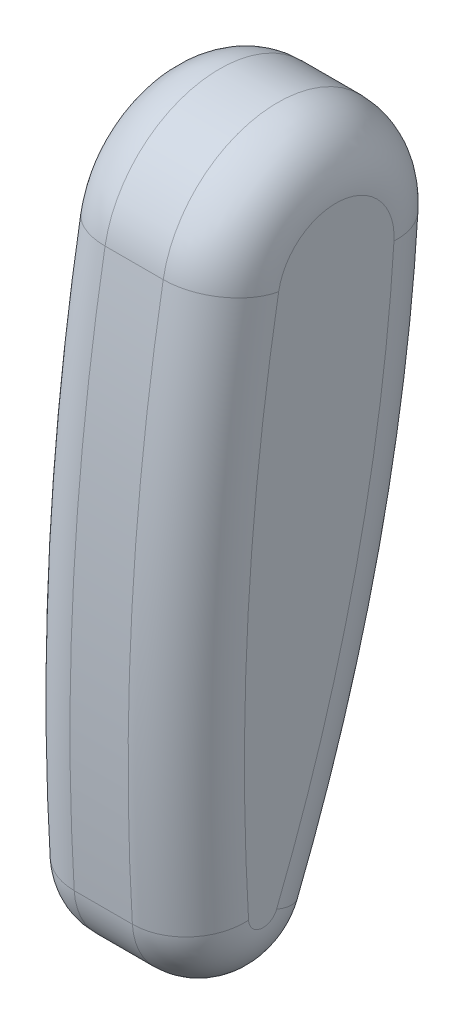
ISO-10303-21;
HEADER;
FILE_DESCRIPTION(('STEP AP214'),'2;1');
FILE_NAME('part.step','',(''),(''),'','','');
FILE_SCHEMA(('AUTOMOTIVE_DESIGN { 1 0 10303 214 1 1 1 1 }'));
ENDSEC;
DATA;
#1=APPLICATION_CONTEXT('core data for automotive mechanical design processes');
#2=APPLICATION_PROTOCOL_DEFINITION('international standard','automotive_design',2000,#1);
#3=PRODUCT_CONTEXT('',#1,'mechanical');
#4=PRODUCT('Part','Part','',(#3));
#5=PRODUCT_RELATED_PRODUCT_CATEGORY('part','',(#4));
#6=PRODUCT_DEFINITION_FORMATION('','',#4);
#7=PRODUCT_DEFINITION_CONTEXT('part definition',#1,'design');
#8=PRODUCT_DEFINITION('design','',#6,#7);
#9=PRODUCT_DEFINITION_SHAPE('','',#8);
#10=(LENGTH_UNIT() NAMED_UNIT(*) SI_UNIT(.MILLI.,.METRE.));
#11=(NAMED_UNIT(*) PLANE_ANGLE_UNIT() SI_UNIT($,.RADIAN.));
#12=(NAMED_UNIT(*) SI_UNIT($,.STERADIAN.) SOLID_ANGLE_UNIT());
#13=UNCERTAINTY_MEASURE_WITH_UNIT(LENGTH_MEASURE(1.E-05),#10,'distance_accuracy_value','');
#14=(GEOMETRIC_REPRESENTATION_CONTEXT(3) GLOBAL_UNCERTAINTY_ASSIGNED_CONTEXT((#13)) GLOBAL_UNIT_ASSIGNED_CONTEXT((#10,
#11,#12)) REPRESENTATION_CONTEXT('',''));
#15=CARTESIAN_POINT('',(0.,0.,0.));
#16=DIRECTION('',(0.,0.,1.));
#17=DIRECTION('',(1.,0.,0.));
#18=AXIS2_PLACEMENT_3D('',#15,#16,#17);
#19=CARTESIAN_POINT('',(190.5,-636.965855606091,-1940.75192617247));
#20=DIRECTION('',(-1.,0.,0.));
#21=DIRECTION('',(0.,0.,1.));
#22=AXIS2_PLACEMENT_3D('',#19,#20,#21);
#23=CYLINDRICAL_SURFACE('',#22,2032.);
#24=DIRECTION('',(-1.,0.,0.));
#25=VECTOR('',#24,1.);
#26=CARTESIAN_POINT('',(190.5,-285.382596894668,60.6009193282554));
#27=LINE('',#26,#25);
#28=CARTESIAN_POINT('',(139.7,-285.382596894668,60.6009193282554));
#29=VERTEX_POINT('',#28);
#30=CARTESIAN_POINT('',(88.9000000000001,-285.382596894668,60.6009193282554));
#31=VERTEX_POINT('',#30);
#32=EDGE_CURVE('E144',#29,#31,#27,.T.);
#33=ORIENTED_EDGE('',*,*,#32,.T.);
#34=CARTESIAN_POINT('',(88.9000000000001,-636.965855606091,-1940.75192617247));
#35=DIRECTION('',(-1.,0.,0.));
#36=DIRECTION('',(0.,0.,1.));
#37=AXIS2_PLACEMENT_3D('',#34,#35,#36);
#38=CIRCLE('',#37,2032.);
#39=CARTESIAN_POINT('',(88.9000000000001,-759.542851996072,87.547578327791));
#40=VERTEX_POINT('',#39);
#41=EDGE_CURVE('E153',#31,#40,#38,.F.);
#42=ORIENTED_EDGE('',*,*,#41,.T.);
#43=DIRECTION('',(-1.,0.,0.));
#44=VECTOR('',#43,1.);
#45=CARTESIAN_POINT('',(190.5,-759.542851996072,87.547578327791));
#46=LINE('',#45,#44);
#47=CARTESIAN_POINT('',(139.7,-759.542851996072,87.547578327791));
#48=VERTEX_POINT('',#47);
#49=EDGE_CURVE('E122',#48,#40,#46,.T.);
#50=ORIENTED_EDGE('',*,*,#49,.F.);
#51=CARTESIAN_POINT('',(139.7,-636.965855606091,-1940.75192617247));
#52=DIRECTION('',(-1.,0.,0.));
#53=DIRECTION('',(0.,0.,1.));
#54=AXIS2_PLACEMENT_3D('',#51,#52,#53);
#55=CIRCLE('',#54,2032.);
#56=EDGE_CURVE('E155',#48,#29,#55,.T.);
#57=ORIENTED_EDGE('',*,*,#56,.T.);
#58=EDGE_LOOP('',(#33,#42,#50,#57));
#59=FACE_BOUND('',#58,.T.);
#60=ADVANCED_FACE('F35',(#59),#23,.T.);
#61=CARTESIAN_POINT('',(190.5,-755.712320858886,24.1632188121575));
#62=DIRECTION('',(-1.,0.,0.));
#63=DIRECTION('',(0.,0.,1.));
#64=AXIS2_PLACEMENT_3D('',#61,#62,#63);
#65=CYLINDRICAL_SURFACE('',#64,63.5000000000002);
#66=ORIENTED_EDGE('',*,*,#49,.T.);
#67=CARTESIAN_POINT('',(88.9000000000001,-755.712320858886,24.1632188121575));
#68=DIRECTION('',(-1.,0.,0.));
#69=DIRECTION('',(0.,0.,1.));
#70=AXIS2_PLACEMENT_3D('',#67,#68,#69);
#71=CIRCLE('',#70,63.5000000000002);
#72=CARTESIAN_POINT('',(88.9000000000001,-779.308424571083,-34.7899311427282));
#73=VERTEX_POINT('',#72);
#74=EDGE_CURVE('E121',#40,#73,#71,.F.);
#75=ORIENTED_EDGE('',*,*,#74,.T.);
#76=DIRECTION('',(-1.,0.,0.));
#77=VECTOR('',#76,1.);
#78=CARTESIAN_POINT('',(190.5,-779.308424571083,-34.7899311427282));
#79=LINE('',#78,#77);
#80=CARTESIAN_POINT('',(139.7,-779.308424571083,-34.7899311427282));
#81=VERTEX_POINT('',#80);
#82=EDGE_CURVE('E104',#81,#73,#79,.T.);
#83=ORIENTED_EDGE('',*,*,#82,.F.);
#84=CARTESIAN_POINT('',(139.7,-755.712320858886,24.1632188121575));
#85=DIRECTION('',(-1.,0.,0.));
#86=DIRECTION('',(0.,0.,1.));
#87=AXIS2_PLACEMENT_3D('',#84,#85,#86);
#88=CIRCLE('',#87,63.5000000000002);
#89=EDGE_CURVE('E118',#81,#48,#88,.T.);
#90=ORIENTED_EDGE('',*,*,#89,.T.);
#91=EDGE_LOOP('',(#66,#75,#83,#90));
#92=FACE_BOUND('',#91,.T.);
#93=ADVANCED_FACE('F117',(#92),#65,.T.);
#94=CARTESIAN_POINT('',(190.5,-213.001935478344,1380.08566777453));
#95=DIRECTION('',(-1.,0.,0.));
#96=DIRECTION('',(0.,0.,1.));
#97=AXIS2_PLACEMENT_3D('',#94,#95,#96);
#98=CYLINDRICAL_SURFACE('',#97,1524.);
#99=ORIENTED_EDGE('',*,*,#82,.T.);
#100=CARTESIAN_POINT('',(88.9000000000001,-213.001935478344,1380.08566777453));
#101=DIRECTION('',(-1.,0.,0.));
#102=DIRECTION('',(0.,0.,1.));
#103=AXIS2_PLACEMENT_3D('',#100,#101,#102);
#104=CIRCLE('',#103,1524.);
#105=CARTESIAN_POINT('',(88.9000000000001,-309.38746156966,-140.863322284017));
#106=VERTEX_POINT('',#105);
#107=EDGE_CURVE('E110',#73,#106,#104,.F.);
#108=ORIENTED_EDGE('',*,*,#107,.T.);
#109=DIRECTION('',(-1.,0.,0.));
#110=VECTOR('',#109,1.);
#111=CARTESIAN_POINT('',(190.5,-309.38746156966,-140.863322284017));
#112=LINE('',#111,#110);
#113=CARTESIAN_POINT('',(139.7,-309.38746156966,-140.863322284017));
#114=VERTEX_POINT('',#113);
#115=EDGE_CURVE('E106',#114,#106,#112,.T.);
#116=ORIENTED_EDGE('',*,*,#115,.F.);
#117=CARTESIAN_POINT('',(139.7,-213.001935478344,1380.08566777453));
#118=DIRECTION('',(-1.,0.,0.));
#119=DIRECTION('',(0.,0.,1.));
#120=AXIS2_PLACEMENT_3D('',#117,#118,#119);
#121=CIRCLE('',#120,1524.);
#122=EDGE_CURVE('E101',#114,#81,#121,.T.);
#123=ORIENTED_EDGE('',*,*,#122,.T.);
#124=EDGE_LOOP('',(#99,#108,#116,#123));
#125=FACE_BOUND('',#124,.T.);
#126=ADVANCED_FACE('F103',(#125),#98,.T.);
#127=CARTESIAN_POINT('',(190.5,-302.961759830239,-39.4667229467812));
#128=DIRECTION('',(-1.,0.,0.));
#129=DIRECTION('',(0.,0.,1.));
#130=AXIS2_PLACEMENT_3D('',#127,#128,#129);
#131=CYLINDRICAL_SURFACE('',#130,101.6);
#132=ORIENTED_EDGE('',*,*,#115,.T.);
#133=CARTESIAN_POINT('',(88.9000000000001,-302.961759830239,-39.4667229467812));
#134=DIRECTION('',(-1.,0.,0.));
#135=DIRECTION('',(0.,0.,1.));
#136=AXIS2_PLACEMENT_3D('',#133,#134,#135);
#137=CIRCLE('',#136,101.6);
#138=EDGE_CURVE('E157',#106,#31,#137,.F.);
#139=ORIENTED_EDGE('',*,*,#138,.T.);
#140=ORIENTED_EDGE('',*,*,#32,.F.);
#141=CARTESIAN_POINT('',(139.7,-302.961759830239,-39.4667229467812));
#142=DIRECTION('',(-1.,0.,0.));
#143=DIRECTION('',(0.,0.,1.));
#144=AXIS2_PLACEMENT_3D('',#141,#142,#143);
#145=CIRCLE('',#144,101.6);
#146=EDGE_CURVE('E159',#29,#114,#145,.T.);
#147=ORIENTED_EDGE('',*,*,#146,.T.);
#148=EDGE_LOOP('',(#132,#139,#140,#147));
#149=FACE_BOUND('',#148,.T.);
#150=ADVANCED_FACE('F197',(#149),#131,.T.);
#151=CARTESIAN_POINT('',(190.5,-469.963807718165,-990.109324559626));
#152=DIRECTION('',(-1.,0.,0.));
#153=DIRECTION('',(0.,0.,1.));
#154=AXIS2_PLACEMENT_3D('',#151,#152,#153);
#155=PLANE('',#154);
#156=CARTESIAN_POINT('',(190.5,-213.001935478344,1380.08566777453));
#157=DIRECTION('',(-1.,0.,0.));
#158=DIRECTION('',(0.,0.,1.));
#159=AXIS2_PLACEMENT_3D('',#156,#157,#158);
#160=CIRCLE('',#159,1473.2);
#161=CARTESIAN_POINT('',(190.5,-760.431541601325,12.3725888211802));
#162=VERTEX_POINT('',#161);
#163=CARTESIAN_POINT('',(190.5,-306.174610699949,-90.1650226153994));
#164=VERTEX_POINT('',#163);
#165=EDGE_CURVE('E44',#162,#164,#160,.F.);
#166=ORIENTED_EDGE('',*,*,#165,.T.);
#167=CARTESIAN_POINT('',(190.5,-302.961759830239,-39.4667229467812));
#168=DIRECTION('',(-1.,0.,0.));
#169=DIRECTION('',(0.,0.,1.));
#170=AXIS2_PLACEMENT_3D('',#167,#168,#169);
#171=CIRCLE('',#170,50.8000000000002);
#172=CARTESIAN_POINT('',(190.5,-294.172178362453,10.5670981907374));
#173=VERTEX_POINT('',#172);
#174=EDGE_CURVE('E11',#164,#173,#171,.F.);
#175=ORIENTED_EDGE('',*,*,#174,.T.);
#176=CARTESIAN_POINT('',(190.5,-636.965855606091,-1940.75192617247));
#177=DIRECTION('',(-1.,0.,0.));
#178=DIRECTION('',(0.,0.,1.));
#179=AXIS2_PLACEMENT_3D('',#176,#177,#178);
#180=CIRCLE('',#179,1981.2);
#181=CARTESIAN_POINT('',(190.5,-756.478427086323,36.8400907152844));
#182=VERTEX_POINT('',#181);
#183=EDGE_CURVE('E151',#173,#182,#180,.F.);
#184=ORIENTED_EDGE('',*,*,#183,.T.);
#185=CARTESIAN_POINT('',(190.5,-755.712320858886,24.1632188121575));
#186=DIRECTION('',(-1.,0.,0.));
#187=DIRECTION('',(0.,0.,1.));
#188=AXIS2_PLACEMENT_3D('',#185,#186,#187);
#189=CIRCLE('',#188,12.7000000000002);
#190=EDGE_CURVE('E55',#182,#162,#189,.F.);
#191=ORIENTED_EDGE('',*,*,#190,.T.);
#192=EDGE_LOOP('',(#166,#175,#184,#191));
#193=FACE_BOUND('',#192,.T.);
#194=ADVANCED_FACE('F203',(#193),#155,.F.);
#195=CARTESIAN_POINT('',(38.1000000000001,-469.963807718165,-990.109324559626));
#196=DIRECTION('',(-1.,0.,0.));
#197=DIRECTION('',(0.,0.,1.));
#198=AXIS2_PLACEMENT_3D('',#195,#196,#197);
#199=PLANE('',#198);
#200=CARTESIAN_POINT('',(38.1000000000001,-213.001935478344,1380.08566777453));
#201=DIRECTION('',(-1.,0.,0.));
#202=DIRECTION('',(0.,0.,1.));
#203=AXIS2_PLACEMENT_3D('',#200,#201,#202);
#204=CIRCLE('',#203,1473.2);
#205=CARTESIAN_POINT('',(38.1000000000001,-306.174610699949,-90.1650226153996));
#206=VERTEX_POINT('',#205);
#207=CARTESIAN_POINT('',(38.1000000000001,-760.431541601325,12.3725888211806));
#208=VERTEX_POINT('',#207);
#209=EDGE_CURVE('E164',#206,#208,#204,.T.);
#210=ORIENTED_EDGE('',*,*,#209,.T.);
#211=CARTESIAN_POINT('',(38.1000000000001,-755.712320858886,24.1632188121575));
#212=DIRECTION('',(-1.,0.,0.));
#213=DIRECTION('',(0.,0.,1.));
#214=AXIS2_PLACEMENT_3D('',#211,#212,#213);
#215=CIRCLE('',#214,12.7000000000002);
#216=CARTESIAN_POINT('',(38.1000000000001,-756.478427086323,36.8400907152844));
#217=VERTEX_POINT('',#216);
#218=EDGE_CURVE('E111',#208,#217,#215,.T.);
#219=ORIENTED_EDGE('',*,*,#218,.T.);
#220=CARTESIAN_POINT('',(38.1000000000001,-636.965855606091,-1940.75192617247));
#221=DIRECTION('',(-1.,0.,0.));
#222=DIRECTION('',(0.,0.,1.));
#223=AXIS2_PLACEMENT_3D('',#220,#221,#222);
#224=CIRCLE('',#223,1981.2);
#225=CARTESIAN_POINT('',(38.1000000000001,-294.172178362453,10.5670981907374));
#226=VERTEX_POINT('',#225);
#227=EDGE_CURVE('E168',#217,#226,#224,.T.);
#228=ORIENTED_EDGE('',*,*,#227,.T.);
#229=CARTESIAN_POINT('',(38.1000000000001,-302.961759830239,-39.4667229467812));
#230=DIRECTION('',(-1.,0.,0.));
#231=DIRECTION('',(0.,0.,1.));
#232=AXIS2_PLACEMENT_3D('',#229,#230,#231);
#233=CIRCLE('',#232,50.8000000000002);
#234=EDGE_CURVE('E166',#226,#206,#233,.T.);
#235=ORIENTED_EDGE('',*,*,#234,.T.);
#236=EDGE_LOOP('',(#210,#219,#228,#235));
#237=FACE_BOUND('',#236,.T.);
#238=ADVANCED_FACE('F205',(#237),#199,.T.);
#239=CARTESIAN_POINT('',(88.9000000000001,-302.961759830239,-39.4667229467812));
#240=DIRECTION('',(-1.,0.,0.));
#241=DIRECTION('',(0.,0.,1.));
#242=AXIS2_PLACEMENT_3D('',#239,#240,#241);
#243=TOROIDAL_SURFACE('',#242,50.8000000000002,50.8);
#244=CARTESIAN_POINT('',(88.9000000000001,-306.174610699949,-90.1650226153996));
#245=DIRECTION('',(0.,-0.997998024972797,0.0632450958604432));
#246=DIRECTION('',(0.,-0.0632450958604432,-0.997998024972797));
#247=AXIS2_PLACEMENT_3D('',#244,#245,#246);
#248=CIRCLE('',#247,50.8);
#249=EDGE_CURVE('E145',#206,#106,#248,.T.);
#250=ORIENTED_EDGE('',*,*,#249,.F.);
#251=ORIENTED_EDGE('',*,*,#234,.F.);
#252=CARTESIAN_POINT('',(88.9000000000001,-294.172178362453,10.5670981907372));
#253=DIRECTION('',(0.,-0.984917738927523,0.173023257239874));
#254=DIRECTION('',(0.,-0.173023257239874,-0.984917738927523));
#255=AXIS2_PLACEMENT_3D('',#252,#253,#254);
#256=CIRCLE('',#255,50.8);
#257=EDGE_CURVE('E141',#31,#226,#256,.T.);
#258=ORIENTED_EDGE('',*,*,#257,.F.);
#259=ORIENTED_EDGE('',*,*,#138,.F.);
#260=EDGE_LOOP('',(#250,#251,#258,#259));
#261=FACE_BOUND('',#260,.T.);
#262=ADVANCED_FACE('F184',(#261),#243,.T.);
#263=CARTESIAN_POINT('',(88.9000000000001,-636.965855606091,-1940.75192617247));
#264=DIRECTION('',(-1.,0.,0.));
#265=DIRECTION('',(0.,0.,1.));
#266=AXIS2_PLACEMENT_3D('',#263,#264,#265);
#267=TOROIDAL_SURFACE('',#266,1981.2,50.8);
#268=ORIENTED_EDGE('',*,*,#257,.T.);
#269=ORIENTED_EDGE('',*,*,#227,.F.);
#270=CARTESIAN_POINT('',(88.9000000000001,-756.478427086323,36.8400907152844));
#271=DIRECTION('',(0.,-0.998178890009972,-0.0603233249950702));
#272=DIRECTION('',(0.,0.0603233249950702,-0.998178890009972));
#273=AXIS2_PLACEMENT_3D('',#270,#271,#272);
#274=CIRCLE('',#273,50.8);
#275=EDGE_CURVE('E132',#40,#217,#274,.T.);
#276=ORIENTED_EDGE('',*,*,#275,.F.);
#277=ORIENTED_EDGE('',*,*,#41,.F.);
#278=EDGE_LOOP('',(#268,#269,#276,#277));
#279=FACE_BOUND('',#278,.T.);
#280=ADVANCED_FACE('F188',(#279),#267,.T.);
#281=CARTESIAN_POINT('',(88.9000000000001,-213.001935478344,1380.08566777453));
#282=DIRECTION('',(-1.,0.,0.));
#283=DIRECTION('',(0.,0.,1.));
#284=AXIS2_PLACEMENT_3D('',#281,#282,#283);
#285=TOROIDAL_SURFACE('',#284,1473.2,50.8);
#286=ORIENTED_EDGE('',*,*,#249,.T.);
#287=ORIENTED_EDGE('',*,*,#107,.F.);
#288=CARTESIAN_POINT('',(88.9000000000001,-760.431541601325,12.3725888211806));
#289=DIRECTION('',(0.,-0.928396062281663,0.371592184444053));
#290=DIRECTION('',(0.,-0.371592184444053,-0.928396062281663));
#291=AXIS2_PLACEMENT_3D('',#288,#289,#290);
#292=CIRCLE('',#291,50.8);
#293=EDGE_CURVE('E131',#208,#73,#292,.T.);
#294=ORIENTED_EDGE('',*,*,#293,.F.);
#295=ORIENTED_EDGE('',*,*,#209,.F.);
#296=EDGE_LOOP('',(#286,#287,#294,#295));
#297=FACE_BOUND('',#296,.T.);
#298=ADVANCED_FACE('F196',(#297),#285,.T.);
#299=CARTESIAN_POINT('',(88.9000000000001,-755.712320858886,24.1632188121575));
#300=DIRECTION('',(-1.,0.,0.));
#301=DIRECTION('',(0.,0.,1.));
#302=AXIS2_PLACEMENT_3D('',#299,#300,#301);
#303=DEGENERATE_TOROIDAL_SURFACE('',#302,12.7000000000002,50.8,.T.);
#304=ORIENTED_EDGE('',*,*,#275,.T.);
#305=ORIENTED_EDGE('',*,*,#218,.F.);
#306=ORIENTED_EDGE('',*,*,#293,.T.);
#307=ORIENTED_EDGE('',*,*,#74,.F.);
#308=EDGE_LOOP('',(#304,#305,#306,#307));
#309=FACE_BOUND('',#308,.T.);
#310=ADVANCED_FACE('F191',(#309),#303,.T.);
#311=CARTESIAN_POINT('',(139.7,-755.712320858886,24.1632188121575));
#312=DIRECTION('',(-1.,0.,0.));
#313=DIRECTION('',(0.,0.,1.));
#314=AXIS2_PLACEMENT_3D('',#311,#312,#313);
#315=DEGENERATE_TOROIDAL_SURFACE('',#314,12.7000000000002,50.8,.T.);
#316=CARTESIAN_POINT('',(139.7,-756.478427086323,36.8400907152844));
#317=DIRECTION('',(0.,0.998178890009972,0.060323324995068));
#318=DIRECTION('',(0.,-0.060323324995068,0.998178890009972));
#319=AXIS2_PLACEMENT_3D('',#316,#317,#318);
#320=CIRCLE('',#319,50.8);
#321=EDGE_CURVE('E127',#48,#182,#320,.T.);
#322=ORIENTED_EDGE('',*,*,#321,.F.);
#323=ORIENTED_EDGE('',*,*,#89,.F.);
#324=CARTESIAN_POINT('',(139.7,-760.431541601325,12.3725888211802));
#325=DIRECTION('',(0.,0.928396062281662,-0.371592184444055));
#326=DIRECTION('',(0.,0.371592184444055,0.928396062281662));
#327=AXIS2_PLACEMENT_3D('',#324,#325,#326);
#328=CIRCLE('',#327,50.8);
#329=EDGE_CURVE('E39',#162,#81,#328,.T.);
#330=ORIENTED_EDGE('',*,*,#329,.F.);
#331=ORIENTED_EDGE('',*,*,#190,.F.);
#332=EDGE_LOOP('',(#322,#323,#330,#331));
#333=FACE_BOUND('',#332,.T.);
#334=ADVANCED_FACE('F37',(#333),#315,.T.);
#335=CARTESIAN_POINT('',(139.7,-213.001935478344,1380.08566777453));
#336=DIRECTION('',(-1.,0.,0.));
#337=DIRECTION('',(0.,0.,1.));
#338=AXIS2_PLACEMENT_3D('',#335,#336,#337);
#339=TOROIDAL_SURFACE('',#338,1473.2,50.8);
#340=ORIENTED_EDGE('',*,*,#329,.T.);
#341=ORIENTED_EDGE('',*,*,#122,.F.);
#342=CARTESIAN_POINT('',(139.7,-306.174610699949,-90.1650226153994));
#343=DIRECTION('',(0.,0.997998024972797,-0.06324509586044));
#344=DIRECTION('',(0.,0.06324509586044,0.997998024972797));
#345=AXIS2_PLACEMENT_3D('',#342,#343,#344);
#346=CIRCLE('',#345,50.8);
#347=EDGE_CURVE('E134',#164,#114,#346,.T.);
#348=ORIENTED_EDGE('',*,*,#347,.F.);
#349=ORIENTED_EDGE('',*,*,#165,.F.);
#350=EDGE_LOOP('',(#340,#341,#348,#349));
#351=FACE_BOUND('',#350,.T.);
#352=ADVANCED_FACE('F130',(#351),#339,.T.);
#353=CARTESIAN_POINT('',(139.7,-636.965855606091,-1940.75192617247));
#354=DIRECTION('',(-1.,0.,0.));
#355=DIRECTION('',(0.,0.,1.));
#356=AXIS2_PLACEMENT_3D('',#353,#354,#355);
#357=TOROIDAL_SURFACE('',#356,1981.2,50.8);
#358=ORIENTED_EDGE('',*,*,#321,.T.);
#359=ORIENTED_EDGE('',*,*,#183,.F.);
#360=CARTESIAN_POINT('',(139.7,-294.172178362453,10.5670981907372));
#361=DIRECTION('',(0.,0.984917738927523,-0.173023257239874));
#362=DIRECTION('',(0.,0.173023257239874,0.984917738927523));
#363=AXIS2_PLACEMENT_3D('',#360,#361,#362);
#364=CIRCLE('',#363,50.8);
#365=EDGE_CURVE('E137',#29,#173,#364,.T.);
#366=ORIENTED_EDGE('',*,*,#365,.F.);
#367=ORIENTED_EDGE('',*,*,#56,.F.);
#368=EDGE_LOOP('',(#358,#359,#366,#367));
#369=FACE_BOUND('',#368,.T.);
#370=ADVANCED_FACE('F202',(#369),#357,.T.);
#371=CARTESIAN_POINT('',(139.7,-302.961759830239,-39.4667229467812));
#372=DIRECTION('',(-1.,0.,0.));
#373=DIRECTION('',(0.,0.,1.));
#374=AXIS2_PLACEMENT_3D('',#371,#372,#373);
#375=TOROIDAL_SURFACE('',#374,50.8000000000002,50.8);
#376=ORIENTED_EDGE('',*,*,#347,.T.);
#377=ORIENTED_EDGE('',*,*,#146,.F.);
#378=ORIENTED_EDGE('',*,*,#365,.T.);
#379=ORIENTED_EDGE('',*,*,#174,.F.);
#380=EDGE_LOOP('',(#376,#377,#378,#379));
#381=FACE_BOUND('',#380,.T.);
#382=ADVANCED_FACE('F200',(#381),#375,.T.);
#383=CLOSED_SHELL('',(#60,#93,#126,#150,#194,#238,#262,#280,#298,#310,#334,#352,#370,#382));
#384=MANIFOLD_SOLID_BREP('B2',#383);
#385=ADVANCED_BREP_SHAPE_REPRESENTATION('',(#18,#384),#14);
#386=SHAPE_DEFINITION_REPRESENTATION(#9,#385);
ENDSEC;
END-ISO-10303-21;
